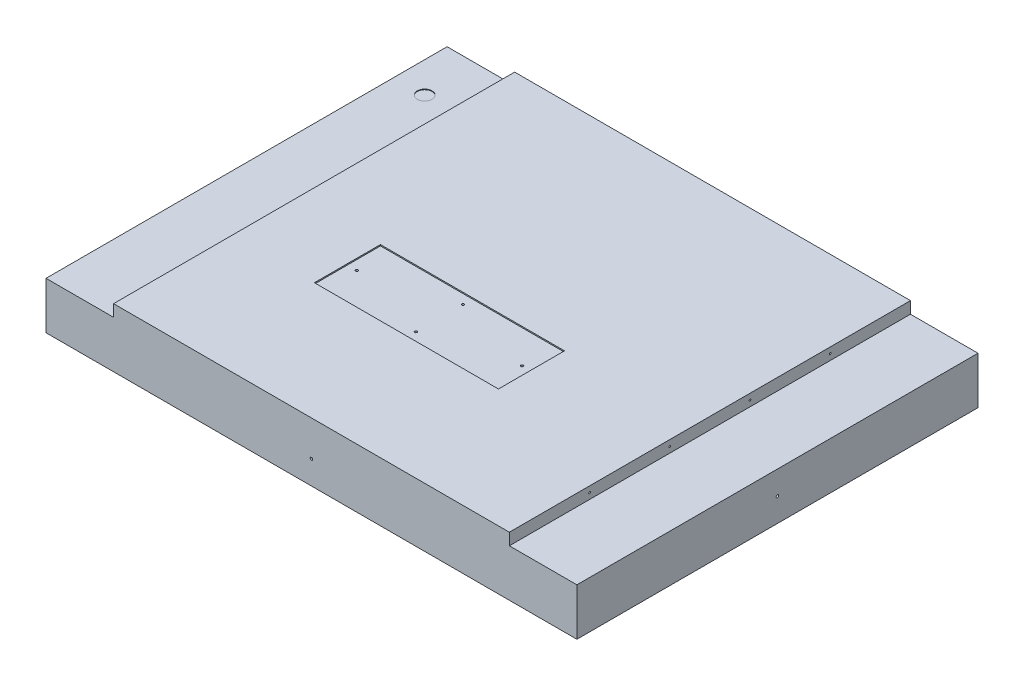
ISO-10303-21;
HEADER;
FILE_DESCRIPTION(('STEP AP214'),'2;1');
FILE_NAME('part.step','',(''),(''),'','','');
FILE_SCHEMA(('AUTOMOTIVE_DESIGN { 1 0 10303 214 1 1 1 1 }'));
ENDSEC;
DATA;
#1=APPLICATION_CONTEXT('core data for automotive mechanical design processes');
#2=APPLICATION_PROTOCOL_DEFINITION('international standard','automotive_design',2000,#1);
#3=PRODUCT_CONTEXT('',#1,'mechanical');
#4=PRODUCT('Part','Part','',(#3));
#5=PRODUCT_RELATED_PRODUCT_CATEGORY('part','',(#4));
#6=PRODUCT_DEFINITION_FORMATION('','',#4);
#7=PRODUCT_DEFINITION_CONTEXT('part definition',#1,'design');
#8=PRODUCT_DEFINITION('design','',#6,#7);
#9=PRODUCT_DEFINITION_SHAPE('','',#8);
#10=(LENGTH_UNIT() NAMED_UNIT(*) SI_UNIT(.MILLI.,.METRE.));
#11=(NAMED_UNIT(*) PLANE_ANGLE_UNIT() SI_UNIT($,.RADIAN.));
#12=(NAMED_UNIT(*) SI_UNIT($,.STERADIAN.) SOLID_ANGLE_UNIT());
#13=UNCERTAINTY_MEASURE_WITH_UNIT(LENGTH_MEASURE(1.E-05),#10,'distance_accuracy_value','');
#14=(GEOMETRIC_REPRESENTATION_CONTEXT(3) GLOBAL_UNCERTAINTY_ASSIGNED_CONTEXT((#13)) GLOBAL_UNIT_ASSIGNED_CONTEXT((#10,
#11,#12)) REPRESENTATION_CONTEXT('',''));
#15=CARTESIAN_POINT('',(0.,0.,0.));
#16=DIRECTION('',(0.,0.,1.));
#17=DIRECTION('',(1.,0.,0.));
#18=AXIS2_PLACEMENT_3D('',#15,#16,#17);
#19=CARTESIAN_POINT('',(0.,40.,340.));
#20=DIRECTION('',(0.,0.,1.));
#21=DIRECTION('',(1.,0.,0.));
#22=AXIS2_PLACEMENT_3D('',#19,#20,#21);
#23=CYLINDRICAL_SURFACE('',#22,2.09999999999995);
#24=CARTESIAN_POINT('',(0.,40.,340.));
#25=DIRECTION('',(0.,0.,1.));
#26=DIRECTION('',(1.,0.,0.));
#27=AXIS2_PLACEMENT_3D('',#24,#25,#26);
#28=CIRCLE('',#27,2.09999999999999);
#29=CARTESIAN_POINT('',(2.10000000000004,40.,340.));
#30=VERTEX_POINT('',#29);
#31=EDGE_CURVE('E240',#30,#30,#28,.T.);
#32=ORIENTED_EDGE('',*,*,#31,.T.);
#33=EDGE_LOOP('',(#32));
#34=FACE_BOUND('',#33,.T.);
#35=CARTESIAN_POINT('',(0.,40.,-1.11022302462516E-13));
#36=DIRECTION('',(0.707106781186548,0.,0.707106781186547));
#37=DIRECTION('',(-0.707106781186547,0.,0.707106781186547));
#38=AXIS2_PLACEMENT_3D('',#35,#36,#37);
#39=ELLIPSE('',#38,2.96984848098342,2.09999999999994);
#40=CARTESIAN_POINT('',(0.,37.9000000000001,-1.11022302462516E-13));
#41=VERTEX_POINT('',#40);
#42=CARTESIAN_POINT('',(0.,42.0999999999999,-1.11022302462516E-13));
#43=VERTEX_POINT('',#42);
#44=EDGE_CURVE('E55',#41,#43,#39,.F.);
#45=ORIENTED_EDGE('',*,*,#44,.T.);
#46=CARTESIAN_POINT('',(0.,40.,-1.11022302462516E-13));
#47=DIRECTION('',(-0.707106781186547,0.,0.707106781186547));
#48=DIRECTION('',(0.707106781186548,0.,0.707106781186547));
#49=AXIS2_PLACEMENT_3D('',#46,#47,#48);
#50=ELLIPSE('',#49,2.96984848098342,2.09999999999994);
#51=EDGE_CURVE('E11',#43,#41,#50,.F.);
#52=ORIENTED_EDGE('',*,*,#51,.T.);
#53=EDGE_LOOP('',(#45,#52));
#54=FACE_BOUND('',#53,.T.);
#55=ADVANCED_FACE('F42',(#34,#54),#23,.F.);
#56=CARTESIAN_POINT('',(0.,80.,0.));
#57=DIRECTION('',(0.,1.,0.));
#58=DIRECTION('',(0.,0.,1.));
#59=AXIS2_PLACEMENT_3D('',#56,#57,#58);
#60=PLANE('',#59);
#61=DIRECTION('',(0.,0.,-1.));
#62=VECTOR('',#61,1.);
#63=CARTESIAN_POINT('',(335.5,80.,-340.));
#64=LINE('',#63,#62);
#65=CARTESIAN_POINT('',(335.5,80.,340.));
#66=VERTEX_POINT('',#65);
#67=CARTESIAN_POINT('',(335.5,80.,-340.));
#68=VERTEX_POINT('',#67);
#69=EDGE_CURVE('E287',#66,#68,#64,.T.);
#70=ORIENTED_EDGE('',*,*,#69,.F.);
#71=DIRECTION('',(1.,0.,0.));
#72=VECTOR('',#71,1.);
#73=CARTESIAN_POINT('',(-450.,80.,340.));
#74=LINE('',#73,#72);
#75=CARTESIAN_POINT('',(450.,80.,340.));
#76=VERTEX_POINT('',#75);
#77=EDGE_CURVE('E329',#66,#76,#74,.T.);
#78=ORIENTED_EDGE('',*,*,#77,.T.);
#79=DIRECTION('',(0.,0.,-1.));
#80=VECTOR('',#79,1.);
#81=CARTESIAN_POINT('',(450.,80.,-340.));
#82=LINE('',#81,#80);
#83=CARTESIAN_POINT('',(450.,80.,-340.));
#84=VERTEX_POINT('',#83);
#85=EDGE_CURVE('E320',#76,#84,#82,.T.);
#86=ORIENTED_EDGE('',*,*,#85,.T.);
#87=DIRECTION('',(-1.,0.,0.));
#88=VECTOR('',#87,1.);
#89=CARTESIAN_POINT('',(-450.,80.,-340.));
#90=LINE('',#89,#88);
#91=EDGE_CURVE('E325',#84,#68,#90,.T.);
#92=ORIENTED_EDGE('',*,*,#91,.T.);
#93=EDGE_LOOP('',(#70,#78,#86,#92));
#94=FACE_BOUND('',#93,.T.);
#95=ADVANCED_FACE('F372',(#94),#60,.T.);
#96=CARTESIAN_POINT('',(450.,80.,-340.));
#97=DIRECTION('',(-1.,0.,0.));
#98=DIRECTION('',(0.,0.,1.));
#99=AXIS2_PLACEMENT_3D('',#96,#97,#98);
#100=PLANE('',#99);
#101=CARTESIAN_POINT('',(450.,40.,-1.4775762313026E-13));
#102=DIRECTION('',(-1.,0.,0.));
#103=DIRECTION('',(0.,0.,1.));
#104=AXIS2_PLACEMENT_3D('',#101,#102,#103);
#105=CIRCLE('',#104,2.09999999999989);
#106=CARTESIAN_POINT('',(450.,40.,2.09999999999974));
#107=VERTEX_POINT('',#106);
#108=EDGE_CURVE('E237',#107,#107,#105,.T.);
#109=ORIENTED_EDGE('',*,*,#108,.T.);
#110=EDGE_LOOP('',(#109));
#111=FACE_BOUND('',#110,.T.);
#112=DIRECTION('',(0.,0.,-1.));
#113=VECTOR('',#112,1.);
#114=CARTESIAN_POINT('',(450.,0.,-340.));
#115=LINE('',#114,#113);
#116=CARTESIAN_POINT('',(450.,0.,340.));
#117=VERTEX_POINT('',#116);
#118=CARTESIAN_POINT('',(450.,0.,-340.));
#119=VERTEX_POINT('',#118);
#120=EDGE_CURVE('E319',#117,#119,#115,.T.);
#121=ORIENTED_EDGE('',*,*,#120,.T.);
#122=DIRECTION('',(0.,-1.,0.));
#123=VECTOR('',#122,1.);
#124=CARTESIAN_POINT('',(450.,80.,-340.));
#125=LINE('',#124,#123);
#126=EDGE_CURVE('E348',#84,#119,#125,.T.);
#127=ORIENTED_EDGE('',*,*,#126,.F.);
#128=ORIENTED_EDGE('',*,*,#85,.F.);
#129=DIRECTION('',(0.,-1.,0.));
#130=VECTOR('',#129,1.);
#131=CARTESIAN_POINT('',(450.,80.,340.));
#132=LINE('',#131,#130);
#133=EDGE_CURVE('E332',#76,#117,#132,.T.);
#134=ORIENTED_EDGE('',*,*,#133,.T.);
#135=EDGE_LOOP('',(#121,#127,#128,#134));
#136=FACE_BOUND('',#135,.T.);
#137=ADVANCED_FACE('F44',(#111,#136),#100,.F.);
#138=CARTESIAN_POINT('',(-450.,80.,-340.));
#139=DIRECTION('',(0.,0.,1.));
#140=DIRECTION('',(1.,0.,0.));
#141=AXIS2_PLACEMENT_3D('',#138,#139,#140);
#142=PLANE('',#141);
#143=CARTESIAN_POINT('',(0.,40.,-340.));
#144=DIRECTION('',(0.,0.,1.));
#145=DIRECTION('',(1.,0.,0.));
#146=AXIS2_PLACEMENT_3D('',#143,#144,#145);
#147=CIRCLE('',#146,2.09999999999992);
#148=CARTESIAN_POINT('',(2.09999999999997,40.,-340.));
#149=VERTEX_POINT('',#148);
#150=EDGE_CURVE('E243',#149,#149,#147,.T.);
#151=ORIENTED_EDGE('',*,*,#150,.T.);
#152=EDGE_LOOP('',(#151));
#153=FACE_BOUND('',#152,.T.);
#154=DIRECTION('',(-1.,0.,0.));
#155=VECTOR('',#154,1.);
#156=CARTESIAN_POINT('',(-450.,0.,-340.));
#157=LINE('',#156,#155);
#158=CARTESIAN_POINT('',(-450.,0.,-340.));
#159=VERTEX_POINT('',#158);
#160=EDGE_CURVE('E335',#119,#159,#157,.T.);
#161=ORIENTED_EDGE('',*,*,#160,.T.);
#162=DIRECTION('',(0.,-1.,0.));
#163=VECTOR('',#162,1.);
#164=CARTESIAN_POINT('',(-450.,80.,-340.));
#165=LINE('',#164,#163);
#166=CARTESIAN_POINT('',(-450.,80.,-340.));
#167=VERTEX_POINT('',#166);
#168=EDGE_CURVE('E345',#167,#159,#165,.T.);
#169=ORIENTED_EDGE('',*,*,#168,.F.);
#170=CARTESIAN_POINT('',(-335.5,80.,-340.));
#171=VERTEX_POINT('',#170);
#172=EDGE_CURVE('E323',#171,#167,#90,.T.);
#173=ORIENTED_EDGE('',*,*,#172,.F.);
#174=DIRECTION('',(0.,-1.,0.));
#175=VECTOR('',#174,1.);
#176=CARTESIAN_POINT('',(-335.5,100.,-340.));
#177=LINE('',#176,#175);
#178=CARTESIAN_POINT('',(-335.5,100.,-340.));
#179=VERTEX_POINT('',#178);
#180=EDGE_CURVE('E313',#179,#171,#177,.T.);
#181=ORIENTED_EDGE('',*,*,#180,.F.);
#182=DIRECTION('',(-1.,0.,0.));
#183=VECTOR('',#182,1.);
#184=CARTESIAN_POINT('',(-335.5,100.,-340.));
#185=LINE('',#184,#183);
#186=CARTESIAN_POINT('',(335.5,100.,-340.));
#187=VERTEX_POINT('',#186);
#188=EDGE_CURVE('E296',#187,#179,#185,.T.);
#189=ORIENTED_EDGE('',*,*,#188,.F.);
#190=DIRECTION('',(0.,-1.,0.));
#191=VECTOR('',#190,1.);
#192=CARTESIAN_POINT('',(335.5,100.,-340.));
#193=LINE('',#192,#191);
#194=EDGE_CURVE('E316',#187,#68,#193,.T.);
#195=ORIENTED_EDGE('',*,*,#194,.T.);
#196=ORIENTED_EDGE('',*,*,#91,.F.);
#197=ORIENTED_EDGE('',*,*,#126,.T.);
#198=EDGE_LOOP('',(#161,#169,#173,#181,#189,#195,#196,#197));
#199=FACE_BOUND('',#198,.T.);
#200=ADVANCED_FACE('F466',(#153,#199),#142,.F.);
#201=CARTESIAN_POINT('',(-450.,80.,-340.));
#202=DIRECTION('',(1.,0.,0.));
#203=DIRECTION('',(0.,0.,-1.));
#204=AXIS2_PLACEMENT_3D('',#201,#202,#203);
#205=PLANE('',#204);
#206=CARTESIAN_POINT('',(-450.,40.,0.));
#207=DIRECTION('',(-1.,0.,0.));
#208=DIRECTION('',(0.,0.,1.));
#209=AXIS2_PLACEMENT_3D('',#206,#207,#208);
#210=CIRCLE('',#209,2.09999999999998);
#211=CARTESIAN_POINT('',(-450.,40.,2.09999999999991));
#212=VERTEX_POINT('',#211);
#213=EDGE_CURVE('E232',#212,#212,#210,.T.);
#214=ORIENTED_EDGE('',*,*,#213,.F.);
#215=EDGE_LOOP('',(#214));
#216=FACE_BOUND('',#215,.T.);
#217=DIRECTION('',(0.,0.,1.));
#218=VECTOR('',#217,1.);
#219=CARTESIAN_POINT('',(-450.,0.,-340.));
#220=LINE('',#219,#218);
#221=CARTESIAN_POINT('',(-450.,0.,340.));
#222=VERTEX_POINT('',#221);
#223=EDGE_CURVE('E337',#159,#222,#220,.T.);
#224=ORIENTED_EDGE('',*,*,#223,.T.);
#225=DIRECTION('',(0.,-1.,0.));
#226=VECTOR('',#225,1.);
#227=CARTESIAN_POINT('',(-450.,80.,340.));
#228=LINE('',#227,#226);
#229=CARTESIAN_POINT('',(-450.,80.,340.));
#230=VERTEX_POINT('',#229);
#231=EDGE_CURVE('E342',#230,#222,#228,.T.);
#232=ORIENTED_EDGE('',*,*,#231,.F.);
#233=DIRECTION('',(0.,0.,1.));
#234=VECTOR('',#233,1.);
#235=CARTESIAN_POINT('',(-450.,80.,-340.));
#236=LINE('',#235,#234);
#237=EDGE_CURVE('E327',#167,#230,#236,.T.);
#238=ORIENTED_EDGE('',*,*,#237,.F.);
#239=ORIENTED_EDGE('',*,*,#168,.T.);
#240=EDGE_LOOP('',(#224,#232,#238,#239));
#241=FACE_BOUND('',#240,.T.);
#242=ADVANCED_FACE('F463',(#216,#241),#205,.F.);
#243=CARTESIAN_POINT('',(-450.,80.,340.));
#244=DIRECTION('',(0.,0.,-1.));
#245=DIRECTION('',(-1.,0.,0.));
#246=AXIS2_PLACEMENT_3D('',#243,#244,#245);
#247=PLANE('',#246);
#248=ORIENTED_EDGE('',*,*,#31,.F.);
#249=EDGE_LOOP('',(#248));
#250=FACE_BOUND('',#249,.T.);
#251=DIRECTION('',(1.,0.,0.));
#252=VECTOR('',#251,1.);
#253=CARTESIAN_POINT('',(-450.,0.,340.));
#254=LINE('',#253,#252);
#255=EDGE_CURVE('E324',#222,#117,#254,.T.);
#256=ORIENTED_EDGE('',*,*,#255,.T.);
#257=ORIENTED_EDGE('',*,*,#133,.F.);
#258=ORIENTED_EDGE('',*,*,#77,.F.);
#259=DIRECTION('',(0.,-1.,0.));
#260=VECTOR('',#259,1.);
#261=CARTESIAN_POINT('',(335.5,100.,340.));
#262=LINE('',#261,#260);
#263=CARTESIAN_POINT('',(335.5,100.,340.));
#264=VERTEX_POINT('',#263);
#265=EDGE_CURVE('E303',#264,#66,#262,.T.);
#266=ORIENTED_EDGE('',*,*,#265,.F.);
#267=DIRECTION('',(1.,0.,0.));
#268=VECTOR('',#267,1.);
#269=CARTESIAN_POINT('',(-335.5,100.,340.));
#270=LINE('',#269,#268);
#271=CARTESIAN_POINT('',(-335.5,100.,340.));
#272=VERTEX_POINT('',#271);
#273=EDGE_CURVE('E301',#272,#264,#270,.T.);
#274=ORIENTED_EDGE('',*,*,#273,.F.);
#275=DIRECTION('',(0.,-1.,0.));
#276=VECTOR('',#275,1.);
#277=CARTESIAN_POINT('',(-335.5,100.,340.));
#278=LINE('',#277,#276);
#279=CARTESIAN_POINT('',(-335.5,80.,340.));
#280=VERTEX_POINT('',#279);
#281=EDGE_CURVE('E310',#272,#280,#278,.T.);
#282=ORIENTED_EDGE('',*,*,#281,.T.);
#283=EDGE_CURVE('E330',#230,#280,#74,.T.);
#284=ORIENTED_EDGE('',*,*,#283,.F.);
#285=ORIENTED_EDGE('',*,*,#231,.T.);
#286=EDGE_LOOP('',(#256,#257,#258,#266,#274,#282,#284,#285));
#287=FACE_BOUND('',#286,.T.);
#288=ADVANCED_FACE('F456',(#250,#287),#247,.F.);
#289=CARTESIAN_POINT('',(-398.,80.,-250.));
#290=DIRECTION('',(0.,1.,0.));
#291=DIRECTION('',(0.,0.,1.));
#292=AXIS2_PLACEMENT_3D('',#289,#290,#291);
#293=CIRCLE('',#292,12.5);
#294=CARTESIAN_POINT('',(-398.,80.,-237.5));
#295=VERTEX_POINT('',#294);
#296=EDGE_CURVE('E228',#295,#295,#293,.T.);
#297=ORIENTED_EDGE('',*,*,#296,.F.);
#298=EDGE_LOOP('',(#297));
#299=FACE_BOUND('',#298,.T.);
#300=DIRECTION('',(0.,0.,1.));
#301=VECTOR('',#300,1.);
#302=CARTESIAN_POINT('',(-335.5,80.,-340.));
#303=LINE('',#302,#301);
#304=EDGE_CURVE('E297',#171,#280,#303,.T.);
#305=ORIENTED_EDGE('',*,*,#304,.F.);
#306=ORIENTED_EDGE('',*,*,#172,.T.);
#307=ORIENTED_EDGE('',*,*,#237,.T.);
#308=ORIENTED_EDGE('',*,*,#283,.T.);
#309=EDGE_LOOP('',(#305,#306,#307,#308));
#310=FACE_BOUND('',#309,.T.);
#311=ADVANCED_FACE('F380',(#299,#310),#60,.T.);
#312=CARTESIAN_POINT('',(0.,0.,0.));
#313=DIRECTION('',(0.,1.,0.));
#314=DIRECTION('',(0.,0.,1.));
#315=AXIS2_PLACEMENT_3D('',#312,#313,#314);
#316=PLANE('',#315);
#317=ORIENTED_EDGE('',*,*,#120,.F.);
#318=ORIENTED_EDGE('',*,*,#255,.F.);
#319=ORIENTED_EDGE('',*,*,#223,.F.);
#320=ORIENTED_EDGE('',*,*,#160,.F.);
#321=EDGE_LOOP('',(#317,#318,#319,#320));
#322=FACE_BOUND('',#321,.T.);
#323=ADVANCED_FACE('F452',(#322),#316,.F.);
#324=CARTESIAN_POINT('',(335.5,100.,-340.));
#325=DIRECTION('',(-1.,0.,0.));
#326=DIRECTION('',(0.,0.,1.));
#327=AXIS2_PLACEMENT_3D('',#324,#325,#326);
#328=PLANE('',#327);
#329=CARTESIAN_POINT('',(335.5,90.,-204.));
#330=DIRECTION('',(1.,0.,0.));
#331=DIRECTION('',(0.,0.,-1.));
#332=AXIS2_PLACEMENT_3D('',#329,#330,#331);
#333=CIRCLE('',#332,1.44999999999999);
#334=CARTESIAN_POINT('',(335.5,90.,-205.45));
#335=VERTEX_POINT('',#334);
#336=EDGE_CURVE('E182',#335,#335,#333,.T.);
#337=ORIENTED_EDGE('',*,*,#336,.F.);
#338=EDGE_LOOP('',(#337));
#339=FACE_BOUND('',#338,.T.);
#340=CARTESIAN_POINT('',(335.5,90.,-67.9999999999999));
#341=DIRECTION('',(1.,0.,0.));
#342=DIRECTION('',(0.,0.,-1.));
#343=AXIS2_PLACEMENT_3D('',#340,#341,#342);
#344=CIRCLE('',#343,1.44999999999999);
#345=CARTESIAN_POINT('',(335.5,90.,-69.4499999999999));
#346=VERTEX_POINT('',#345);
#347=EDGE_CURVE('E181',#346,#346,#344,.T.);
#348=ORIENTED_EDGE('',*,*,#347,.F.);
#349=EDGE_LOOP('',(#348));
#350=FACE_BOUND('',#349,.T.);
#351=CARTESIAN_POINT('',(335.5,90.,68.0000000000001));
#352=DIRECTION('',(1.,0.,0.));
#353=DIRECTION('',(0.,0.,-1.));
#354=AXIS2_PLACEMENT_3D('',#351,#352,#353);
#355=CIRCLE('',#354,1.44999999999999);
#356=CARTESIAN_POINT('',(335.5,90.,66.5500000000001));
#357=VERTEX_POINT('',#356);
#358=EDGE_CURVE('E192',#357,#357,#355,.T.);
#359=ORIENTED_EDGE('',*,*,#358,.F.);
#360=EDGE_LOOP('',(#359));
#361=FACE_BOUND('',#360,.T.);
#362=CARTESIAN_POINT('',(335.5,90.,204.));
#363=DIRECTION('',(1.,0.,0.));
#364=DIRECTION('',(0.,0.,-1.));
#365=AXIS2_PLACEMENT_3D('',#362,#363,#364);
#366=CIRCLE('',#365,1.44999999999999);
#367=CARTESIAN_POINT('',(335.5,90.,202.55));
#368=VERTEX_POINT('',#367);
#369=EDGE_CURVE('E198',#368,#368,#366,.T.);
#370=ORIENTED_EDGE('',*,*,#369,.F.);
#371=EDGE_LOOP('',(#370));
#372=FACE_BOUND('',#371,.T.);
#373=ORIENTED_EDGE('',*,*,#69,.T.);
#374=ORIENTED_EDGE('',*,*,#194,.F.);
#375=DIRECTION('',(0.,0.,-1.));
#376=VECTOR('',#375,1.);
#377=CARTESIAN_POINT('',(335.5,100.,-340.));
#378=LINE('',#377,#376);
#379=EDGE_CURVE('E293',#264,#187,#378,.T.);
#380=ORIENTED_EDGE('',*,*,#379,.F.);
#381=ORIENTED_EDGE('',*,*,#265,.T.);
#382=EDGE_LOOP('',(#373,#374,#380,#381));
#383=FACE_BOUND('',#382,.T.);
#384=ADVANCED_FACE('F449',(#339,#350,#361,#372,#383),#328,.F.);
#385=CARTESIAN_POINT('',(-335.5,100.,-340.));
#386=DIRECTION('',(1.,0.,0.));
#387=DIRECTION('',(0.,0.,-1.));
#388=AXIS2_PLACEMENT_3D('',#385,#386,#387);
#389=PLANE('',#388);
#390=CARTESIAN_POINT('',(-335.5,90.,-204.));
#391=DIRECTION('',(-1.,0.,0.));
#392=DIRECTION('',(0.,0.,1.));
#393=AXIS2_PLACEMENT_3D('',#390,#391,#392);
#394=CIRCLE('',#393,1.44999999999999);
#395=CARTESIAN_POINT('',(-335.5,90.,-202.55));
#396=VERTEX_POINT('',#395);
#397=EDGE_CURVE('E204',#396,#396,#394,.T.);
#398=ORIENTED_EDGE('',*,*,#397,.F.);
#399=EDGE_LOOP('',(#398));
#400=FACE_BOUND('',#399,.T.);
#401=CARTESIAN_POINT('',(-335.5,90.,-67.9999999999999));
#402=DIRECTION('',(-1.,0.,0.));
#403=DIRECTION('',(0.,0.,1.));
#404=AXIS2_PLACEMENT_3D('',#401,#402,#403);
#405=CIRCLE('',#404,1.44999999999999);
#406=CARTESIAN_POINT('',(-335.5,90.,-66.55));
#407=VERTEX_POINT('',#406);
#408=EDGE_CURVE('E210',#407,#407,#405,.T.);
#409=ORIENTED_EDGE('',*,*,#408,.F.);
#410=EDGE_LOOP('',(#409));
#411=FACE_BOUND('',#410,.T.);
#412=CARTESIAN_POINT('',(-335.5,90.,68.0000000000001));
#413=DIRECTION('',(-1.,0.,0.));
#414=DIRECTION('',(0.,0.,1.));
#415=AXIS2_PLACEMENT_3D('',#412,#413,#414);
#416=CIRCLE('',#415,1.44999999999999);
#417=CARTESIAN_POINT('',(-335.5,90.,69.4500000000001));
#418=VERTEX_POINT('',#417);
#419=EDGE_CURVE('E216',#418,#418,#416,.T.);
#420=ORIENTED_EDGE('',*,*,#419,.F.);
#421=EDGE_LOOP('',(#420));
#422=FACE_BOUND('',#421,.T.);
#423=CARTESIAN_POINT('',(-335.5,90.,204.));
#424=DIRECTION('',(-1.,0.,0.));
#425=DIRECTION('',(0.,0.,1.));
#426=AXIS2_PLACEMENT_3D('',#423,#424,#425);
#427=CIRCLE('',#426,1.44999999999999);
#428=CARTESIAN_POINT('',(-335.5,90.,205.45));
#429=VERTEX_POINT('',#428);
#430=EDGE_CURVE('E222',#429,#429,#427,.T.);
#431=ORIENTED_EDGE('',*,*,#430,.F.);
#432=EDGE_LOOP('',(#431));
#433=FACE_BOUND('',#432,.T.);
#434=ORIENTED_EDGE('',*,*,#304,.T.);
#435=ORIENTED_EDGE('',*,*,#281,.F.);
#436=DIRECTION('',(0.,0.,1.));
#437=VECTOR('',#436,1.);
#438=CARTESIAN_POINT('',(-335.5,100.,-340.));
#439=LINE('',#438,#437);
#440=EDGE_CURVE('E299',#179,#272,#439,.T.);
#441=ORIENTED_EDGE('',*,*,#440,.F.);
#442=ORIENTED_EDGE('',*,*,#180,.T.);
#443=EDGE_LOOP('',(#434,#435,#441,#442));
#444=FACE_BOUND('',#443,.T.);
#445=ADVANCED_FACE('F445',(#400,#411,#422,#433,#444),#389,.F.);
#446=CARTESIAN_POINT('',(0.,100.,0.));
#447=DIRECTION('',(0.,1.,0.));
#448=DIRECTION('',(0.,0.,1.));
#449=AXIS2_PLACEMENT_3D('',#446,#447,#448);
#450=PLANE('',#449);
#451=DIRECTION('',(0.,0.,-1.));
#452=VECTOR('',#451,1.);
#453=CARTESIAN_POINT('',(116.,100.,27.));
#454=LINE('',#453,#452);
#455=CARTESIAN_POINT('',(116.,100.,139.));
#456=VERTEX_POINT('',#455);
#457=CARTESIAN_POINT('',(116.,100.,27.));
#458=VERTEX_POINT('',#457);
#459=EDGE_CURVE('E63',#456,#458,#454,.T.);
#460=ORIENTED_EDGE('',*,*,#459,.F.);
#461=DIRECTION('',(1.,0.,0.));
#462=VECTOR('',#461,1.);
#463=CARTESIAN_POINT('',(-196.,100.,139.));
#464=LINE('',#463,#462);
#465=CARTESIAN_POINT('',(-196.,100.,139.));
#466=VERTEX_POINT('',#465);
#467=EDGE_CURVE('E266',#466,#456,#464,.T.);
#468=ORIENTED_EDGE('',*,*,#467,.F.);
#469=DIRECTION('',(0.,0.,1.));
#470=VECTOR('',#469,1.);
#471=CARTESIAN_POINT('',(-196.,100.,27.));
#472=LINE('',#471,#470);
#473=CARTESIAN_POINT('',(-196.,100.,27.));
#474=VERTEX_POINT('',#473);
#475=EDGE_CURVE('E280',#474,#466,#472,.T.);
#476=ORIENTED_EDGE('',*,*,#475,.F.);
#477=DIRECTION('',(-1.,0.,0.));
#478=VECTOR('',#477,1.);
#479=CARTESIAN_POINT('',(-196.,100.,27.));
#480=LINE('',#479,#478);
#481=EDGE_CURVE('E277',#458,#474,#480,.T.);
#482=ORIENTED_EDGE('',*,*,#481,.F.);
#483=EDGE_LOOP('',(#460,#468,#476,#482));
#484=FACE_BOUND('',#483,.T.);
#485=ORIENTED_EDGE('',*,*,#379,.T.);
#486=ORIENTED_EDGE('',*,*,#188,.T.);
#487=ORIENTED_EDGE('',*,*,#440,.T.);
#488=ORIENTED_EDGE('',*,*,#273,.T.);
#489=EDGE_LOOP('',(#485,#486,#487,#488));
#490=FACE_BOUND('',#489,.T.);
#491=ADVANCED_FACE('F442',(#484,#490),#450,.T.);
#492=CARTESIAN_POINT('',(116.,98.,27.));
#493=DIRECTION('',(1.,0.,0.));
#494=DIRECTION('',(0.,0.,-1.));
#495=AXIS2_PLACEMENT_3D('',#492,#493,#494);
#496=PLANE('',#495);
#497=ORIENTED_EDGE('',*,*,#459,.T.);
#498=DIRECTION('',(0.,1.,0.));
#499=VECTOR('',#498,1.);
#500=CARTESIAN_POINT('',(116.,98.,27.));
#501=LINE('',#500,#499);
#502=CARTESIAN_POINT('',(116.,98.,27.));
#503=VERTEX_POINT('',#502);
#504=EDGE_CURVE('E275',#503,#458,#501,.T.);
#505=ORIENTED_EDGE('',*,*,#504,.F.);
#506=DIRECTION('',(0.,0.,-1.));
#507=VECTOR('',#506,1.);
#508=CARTESIAN_POINT('',(116.,98.,27.));
#509=LINE('',#508,#507);
#510=CARTESIAN_POINT('',(116.,98.,139.));
#511=VERTEX_POINT('',#510);
#512=EDGE_CURVE('E262',#511,#503,#509,.T.);
#513=ORIENTED_EDGE('',*,*,#512,.F.);
#514=DIRECTION('',(0.,1.,0.));
#515=VECTOR('',#514,1.);
#516=CARTESIAN_POINT('',(116.,98.,139.));
#517=LINE('',#516,#515);
#518=EDGE_CURVE('E285',#511,#456,#517,.T.);
#519=ORIENTED_EDGE('',*,*,#518,.T.);
#520=EDGE_LOOP('',(#497,#505,#513,#519));
#521=FACE_BOUND('',#520,.T.);
#522=ADVANCED_FACE('F432',(#521),#496,.F.);
#523=CARTESIAN_POINT('',(-196.,98.,139.));
#524=DIRECTION('',(0.,0.,1.));
#525=DIRECTION('',(1.,0.,0.));
#526=AXIS2_PLACEMENT_3D('',#523,#524,#525);
#527=PLANE('',#526);
#528=ORIENTED_EDGE('',*,*,#467,.T.);
#529=ORIENTED_EDGE('',*,*,#518,.F.);
#530=DIRECTION('',(1.,0.,0.));
#531=VECTOR('',#530,1.);
#532=CARTESIAN_POINT('',(-196.,98.,139.));
#533=LINE('',#532,#531);
#534=CARTESIAN_POINT('',(-196.,98.,139.));
#535=VERTEX_POINT('',#534);
#536=EDGE_CURVE('E272',#535,#511,#533,.T.);
#537=ORIENTED_EDGE('',*,*,#536,.F.);
#538=DIRECTION('',(0.,1.,0.));
#539=VECTOR('',#538,1.);
#540=CARTESIAN_POINT('',(-196.,98.,139.));
#541=LINE('',#540,#539);
#542=EDGE_CURVE('E288',#535,#466,#541,.T.);
#543=ORIENTED_EDGE('',*,*,#542,.T.);
#544=EDGE_LOOP('',(#528,#529,#537,#543));
#545=FACE_BOUND('',#544,.T.);
#546=ADVANCED_FACE('F428',(#545),#527,.F.);
#547=CARTESIAN_POINT('',(-196.,98.,27.));
#548=DIRECTION('',(-1.,0.,0.));
#549=DIRECTION('',(0.,0.,1.));
#550=AXIS2_PLACEMENT_3D('',#547,#548,#549);
#551=PLANE('',#550);
#552=ORIENTED_EDGE('',*,*,#475,.T.);
#553=ORIENTED_EDGE('',*,*,#542,.F.);
#554=DIRECTION('',(0.,0.,1.));
#555=VECTOR('',#554,1.);
#556=CARTESIAN_POINT('',(-196.,98.,27.));
#557=LINE('',#556,#555);
#558=CARTESIAN_POINT('',(-196.,98.,27.));
#559=VERTEX_POINT('',#558);
#560=EDGE_CURVE('E269',#559,#535,#557,.T.);
#561=ORIENTED_EDGE('',*,*,#560,.F.);
#562=DIRECTION('',(0.,1.,0.));
#563=VECTOR('',#562,1.);
#564=CARTESIAN_POINT('',(-196.,98.,27.));
#565=LINE('',#564,#563);
#566=EDGE_CURVE('E290',#559,#474,#565,.T.);
#567=ORIENTED_EDGE('',*,*,#566,.T.);
#568=EDGE_LOOP('',(#552,#553,#561,#567));
#569=FACE_BOUND('',#568,.T.);
#570=ADVANCED_FACE('F431',(#569),#551,.F.);
#571=CARTESIAN_POINT('',(-196.,98.,27.));
#572=DIRECTION('',(0.,0.,-1.));
#573=DIRECTION('',(-1.,0.,0.));
#574=AXIS2_PLACEMENT_3D('',#571,#572,#573);
#575=PLANE('',#574);
#576=ORIENTED_EDGE('',*,*,#481,.T.);
#577=ORIENTED_EDGE('',*,*,#566,.F.);
#578=DIRECTION('',(-1.,0.,0.));
#579=VECTOR('',#578,1.);
#580=CARTESIAN_POINT('',(-196.,98.,27.));
#581=LINE('',#580,#579);
#582=EDGE_CURVE('E265',#503,#559,#581,.T.);
#583=ORIENTED_EDGE('',*,*,#582,.F.);
#584=ORIENTED_EDGE('',*,*,#504,.T.);
#585=EDGE_LOOP('',(#576,#577,#583,#584));
#586=FACE_BOUND('',#585,.T.);
#587=ADVANCED_FACE('F426',(#586),#575,.F.);
#588=CARTESIAN_POINT('',(0.,98.,0.));
#589=DIRECTION('',(0.,1.,0.));
#590=DIRECTION('',(0.,0.,1.));
#591=AXIS2_PLACEMENT_3D('',#588,#589,#590);
#592=PLANE('',#591);
#593=CARTESIAN_POINT('',(-180.,98.,83.));
#594=DIRECTION('',(0.,1.,0.));
#595=DIRECTION('',(0.,0.,1.));
#596=AXIS2_PLACEMENT_3D('',#593,#594,#595);
#597=CIRCLE('',#596,2.09999999999999);
#598=CARTESIAN_POINT('',(-180.,98.,85.1));
#599=VERTEX_POINT('',#598);
#600=EDGE_CURVE('E249',#599,#599,#597,.T.);
#601=ORIENTED_EDGE('',*,*,#600,.F.);
#602=EDGE_LOOP('',(#601));
#603=FACE_BOUND('',#602,.T.);
#604=CARTESIAN_POINT('',(-40.,98.,43.));
#605=DIRECTION('',(0.,1.,0.));
#606=DIRECTION('',(0.,0.,1.));
#607=AXIS2_PLACEMENT_3D('',#604,#605,#606);
#608=CIRCLE('',#607,2.09999999999999);
#609=CARTESIAN_POINT('',(-40.,98.,45.1));
#610=VERTEX_POINT('',#609);
#611=EDGE_CURVE('E253',#610,#610,#608,.T.);
#612=ORIENTED_EDGE('',*,*,#611,.F.);
#613=EDGE_LOOP('',(#612));
#614=FACE_BOUND('',#613,.T.);
#615=CARTESIAN_POINT('',(-40.,98.,123.));
#616=DIRECTION('',(0.,1.,0.));
#617=DIRECTION('',(0.,0.,1.));
#618=AXIS2_PLACEMENT_3D('',#615,#616,#617);
#619=CIRCLE('',#618,2.09999999999999);
#620=CARTESIAN_POINT('',(-40.,98.,125.1));
#621=VERTEX_POINT('',#620);
#622=EDGE_CURVE('E257',#621,#621,#619,.T.);
#623=ORIENTED_EDGE('',*,*,#622,.F.);
#624=EDGE_LOOP('',(#623));
#625=FACE_BOUND('',#624,.T.);
#626=CARTESIAN_POINT('',(100.,98.,83.));
#627=DIRECTION('',(0.,1.,0.));
#628=DIRECTION('',(0.,0.,1.));
#629=AXIS2_PLACEMENT_3D('',#626,#627,#628);
#630=CIRCLE('',#629,2.1);
#631=CARTESIAN_POINT('',(100.,98.,85.1));
#632=VERTEX_POINT('',#631);
#633=EDGE_CURVE('E261',#632,#632,#630,.T.);
#634=ORIENTED_EDGE('',*,*,#633,.F.);
#635=EDGE_LOOP('',(#634));
#636=FACE_BOUND('',#635,.T.);
#637=ORIENTED_EDGE('',*,*,#512,.T.);
#638=ORIENTED_EDGE('',*,*,#582,.T.);
#639=ORIENTED_EDGE('',*,*,#560,.T.);
#640=ORIENTED_EDGE('',*,*,#536,.T.);
#641=EDGE_LOOP('',(#637,#638,#639,#640));
#642=FACE_BOUND('',#641,.T.);
#643=ADVANCED_FACE('F422',(#603,#614,#625,#636,#642),#592,.T.);
#644=CARTESIAN_POINT('',(100.,91.,83.));
#645=DIRECTION('',(0.,1.,0.));
#646=DIRECTION('',(0.,0.,1.));
#647=AXIS2_PLACEMENT_3D('',#644,#645,#646);
#648=CONICAL_SURFACE('',#647,2.1,1.02974425867666);
#649=CARTESIAN_POINT('',(100.,89.7381927000421,83.));
#650=VERTEX_POINT('',#649);
#651=VERTEX_LOOP('',#650);
#652=FACE_BOUND('',#651,.T.);
#653=CARTESIAN_POINT('',(100.,91.,83.));
#654=DIRECTION('',(0.,1.,0.));
#655=DIRECTION('',(0.,0.,1.));
#656=AXIS2_PLACEMENT_3D('',#653,#654,#655);
#657=CIRCLE('',#656,2.1);
#658=CARTESIAN_POINT('',(100.,91.,85.1));
#659=VERTEX_POINT('',#658);
#660=EDGE_CURVE('E258',#659,#659,#657,.T.);
#661=ORIENTED_EDGE('',*,*,#660,.T.);
#662=EDGE_LOOP('',(#661));
#663=FACE_BOUND('',#662,.T.);
#664=ADVANCED_FACE('F418',(#652,#663),#648,.F.);
#665=CARTESIAN_POINT('',(100.,100.,83.));
#666=DIRECTION('',(0.,1.,0.));
#667=DIRECTION('',(0.,0.,1.));
#668=AXIS2_PLACEMENT_3D('',#665,#666,#667);
#669=CYLINDRICAL_SURFACE('',#668,2.1);
#670=ORIENTED_EDGE('',*,*,#633,.T.);
#671=EDGE_LOOP('',(#670));
#672=FACE_BOUND('',#671,.T.);
#673=ORIENTED_EDGE('',*,*,#660,.F.);
#674=EDGE_LOOP('',(#673));
#675=FACE_BOUND('',#674,.T.);
#676=ADVANCED_FACE('F414',(#672,#675),#669,.F.);
#677=CARTESIAN_POINT('',(-40.,91.,123.));
#678=DIRECTION('',(0.,1.,0.));
#679=DIRECTION('',(0.,0.,1.));
#680=AXIS2_PLACEMENT_3D('',#677,#678,#679);
#681=CONICAL_SURFACE('',#680,2.1,1.02974425867666);
#682=CARTESIAN_POINT('',(-40.,89.7381927000421,123.));
#683=VERTEX_POINT('',#682);
#684=VERTEX_LOOP('',#683);
#685=FACE_BOUND('',#684,.T.);
#686=CARTESIAN_POINT('',(-40.,91.,123.));
#687=DIRECTION('',(0.,1.,0.));
#688=DIRECTION('',(0.,0.,1.));
#689=AXIS2_PLACEMENT_3D('',#686,#687,#688);
#690=CIRCLE('',#689,2.1);
#691=CARTESIAN_POINT('',(-40.,91.,125.1));
#692=VERTEX_POINT('',#691);
#693=EDGE_CURVE('E254',#692,#692,#690,.T.);
#694=ORIENTED_EDGE('',*,*,#693,.T.);
#695=EDGE_LOOP('',(#694));
#696=FACE_BOUND('',#695,.T.);
#697=ADVANCED_FACE('F410',(#685,#696),#681,.F.);
#698=CARTESIAN_POINT('',(-40.,100.,123.));
#699=DIRECTION('',(0.,1.,0.));
#700=DIRECTION('',(0.,0.,1.));
#701=AXIS2_PLACEMENT_3D('',#698,#699,#700);
#702=CYLINDRICAL_SURFACE('',#701,2.09999999999999);
#703=ORIENTED_EDGE('',*,*,#622,.T.);
#704=EDGE_LOOP('',(#703));
#705=FACE_BOUND('',#704,.T.);
#706=ORIENTED_EDGE('',*,*,#693,.F.);
#707=EDGE_LOOP('',(#706));
#708=FACE_BOUND('',#707,.T.);
#709=ADVANCED_FACE('F406',(#705,#708),#702,.F.);
#710=CARTESIAN_POINT('',(-40.,91.,43.));
#711=DIRECTION('',(0.,1.,0.));
#712=DIRECTION('',(0.,0.,1.));
#713=AXIS2_PLACEMENT_3D('',#710,#711,#712);
#714=CONICAL_SURFACE('',#713,2.1,1.02974425867666);
#715=CARTESIAN_POINT('',(-40.,89.7381927000421,43.));
#716=VERTEX_POINT('',#715);
#717=VERTEX_LOOP('',#716);
#718=FACE_BOUND('',#717,.T.);
#719=CARTESIAN_POINT('',(-40.,91.,43.));
#720=DIRECTION('',(0.,1.,0.));
#721=DIRECTION('',(0.,0.,1.));
#722=AXIS2_PLACEMENT_3D('',#719,#720,#721);
#723=CIRCLE('',#722,2.1);
#724=CARTESIAN_POINT('',(-40.,91.,45.1));
#725=VERTEX_POINT('',#724);
#726=EDGE_CURVE('E250',#725,#725,#723,.T.);
#727=ORIENTED_EDGE('',*,*,#726,.T.);
#728=EDGE_LOOP('',(#727));
#729=FACE_BOUND('',#728,.T.);
#730=ADVANCED_FACE('F402',(#718,#729),#714,.F.);
#731=CARTESIAN_POINT('',(-40.,100.,43.));
#732=DIRECTION('',(0.,1.,0.));
#733=DIRECTION('',(0.,0.,1.));
#734=AXIS2_PLACEMENT_3D('',#731,#732,#733);
#735=CYLINDRICAL_SURFACE('',#734,2.09999999999999);
#736=ORIENTED_EDGE('',*,*,#611,.T.);
#737=EDGE_LOOP('',(#736));
#738=FACE_BOUND('',#737,.T.);
#739=ORIENTED_EDGE('',*,*,#726,.F.);
#740=EDGE_LOOP('',(#739));
#741=FACE_BOUND('',#740,.T.);
#742=ADVANCED_FACE('F395',(#738,#741),#735,.F.);
#743=CARTESIAN_POINT('',(-180.,91.,83.));
#744=DIRECTION('',(0.,1.,0.));
#745=DIRECTION('',(0.,0.,1.));
#746=AXIS2_PLACEMENT_3D('',#743,#744,#745);
#747=CONICAL_SURFACE('',#746,2.09999999999999,1.02974425867666);
#748=CARTESIAN_POINT('',(-180.,89.7381927000421,83.));
#749=VERTEX_POINT('',#748);
#750=VERTEX_LOOP('',#749);
#751=FACE_BOUND('',#750,.T.);
#752=CARTESIAN_POINT('',(-180.,91.,83.));
#753=DIRECTION('',(0.,1.,0.));
#754=DIRECTION('',(0.,0.,1.));
#755=AXIS2_PLACEMENT_3D('',#752,#753,#754);
#756=CIRCLE('',#755,2.09999999999999);
#757=CARTESIAN_POINT('',(-180.,91.,85.1));
#758=VERTEX_POINT('',#757);
#759=EDGE_CURVE('E246',#758,#758,#756,.T.);
#760=ORIENTED_EDGE('',*,*,#759,.T.);
#761=EDGE_LOOP('',(#760));
#762=FACE_BOUND('',#761,.T.);
#763=ADVANCED_FACE('F390',(#751,#762),#747,.F.);
#764=CARTESIAN_POINT('',(-180.,100.,83.));
#765=DIRECTION('',(0.,1.,0.));
#766=DIRECTION('',(0.,0.,1.));
#767=AXIS2_PLACEMENT_3D('',#764,#765,#766);
#768=CYLINDRICAL_SURFACE('',#767,2.09999999999999);
#769=ORIENTED_EDGE('',*,*,#600,.T.);
#770=EDGE_LOOP('',(#769));
#771=FACE_BOUND('',#770,.T.);
#772=ORIENTED_EDGE('',*,*,#759,.F.);
#773=EDGE_LOOP('',(#772));
#774=FACE_BOUND('',#773,.T.);
#775=ADVANCED_FACE('F384',(#771,#774),#768,.F.);
#776=CARTESIAN_POINT('',(0.,40.,-1.11022302462516E-13));
#777=DIRECTION('',(0.707106781186548,0.,0.707106781186547));
#778=DIRECTION('',(-0.707106781186547,0.,0.707106781186547));
#779=AXIS2_PLACEMENT_3D('',#776,#777,#778);
#780=ELLIPSE('',#779,2.96984848098342,2.09999999999994);
#781=EDGE_CURVE('E360',#41,#43,#780,.T.);
#782=ORIENTED_EDGE('',*,*,#781,.T.);
#783=CARTESIAN_POINT('',(0.,40.,-1.11022302462516E-13));
#784=DIRECTION('',(-0.707106781186547,0.,0.707106781186547));
#785=DIRECTION('',(0.707106781186548,0.,0.707106781186547));
#786=AXIS2_PLACEMENT_3D('',#783,#784,#785);
#787=ELLIPSE('',#786,2.96984848098342,2.09999999999994);
#788=EDGE_CURVE('E50',#43,#41,#787,.T.);
#789=ORIENTED_EDGE('',*,*,#788,.T.);
#790=EDGE_LOOP('',(#782,#789));
#791=FACE_BOUND('',#790,.T.);
#792=ORIENTED_EDGE('',*,*,#150,.F.);
#793=EDGE_LOOP('',(#792));
#794=FACE_BOUND('',#793,.T.);
#795=ADVANCED_FACE('F364',(#791,#794),#23,.F.);
#796=CARTESIAN_POINT('',(-450.,40.,0.));
#797=DIRECTION('',(-1.,0.,0.));
#798=DIRECTION('',(0.,0.,1.));
#799=AXIS2_PLACEMENT_3D('',#796,#797,#798);
#800=CYLINDRICAL_SURFACE('',#799,2.09999999999994);
#801=ORIENTED_EDGE('',*,*,#213,.T.);
#802=EDGE_LOOP('',(#801));
#803=FACE_BOUND('',#802,.T.);
#804=ORIENTED_EDGE('',*,*,#44,.F.);
#805=ORIENTED_EDGE('',*,*,#788,.F.);
#806=EDGE_LOOP('',(#804,#805));
#807=FACE_BOUND('',#806,.T.);
#808=ADVANCED_FACE('F368',(#803,#807),#800,.F.);
#809=ORIENTED_EDGE('',*,*,#108,.F.);
#810=EDGE_LOOP('',(#809));
#811=FACE_BOUND('',#810,.T.);
#812=ORIENTED_EDGE('',*,*,#781,.F.);
#813=ORIENTED_EDGE('',*,*,#51,.F.);
#814=EDGE_LOOP('',(#812,#813));
#815=FACE_BOUND('',#814,.T.);
#816=ADVANCED_FACE('F370',(#811,#815),#800,.F.);
#817=CARTESIAN_POINT('',(-398.,79.,-250.));
#818=DIRECTION('',(0.,1.,0.));
#819=DIRECTION('',(0.,0.,1.));
#820=AXIS2_PLACEMENT_3D('',#817,#818,#819);
#821=CYLINDRICAL_SURFACE('',#820,12.5);
#822=CARTESIAN_POINT('',(-398.,79.,-250.));
#823=DIRECTION('',(0.,1.,0.));
#824=DIRECTION('',(0.,0.,1.));
#825=AXIS2_PLACEMENT_3D('',#822,#823,#824);
#826=CIRCLE('',#825,12.5);
#827=CARTESIAN_POINT('',(-398.,79.,-237.5));
#828=VERTEX_POINT('',#827);
#829=EDGE_CURVE('E229',#828,#828,#826,.T.);
#830=ORIENTED_EDGE('',*,*,#829,.F.);
#831=EDGE_LOOP('',(#830));
#832=FACE_BOUND('',#831,.T.);
#833=ORIENTED_EDGE('',*,*,#296,.T.);
#834=EDGE_LOOP('',(#833));
#835=FACE_BOUND('',#834,.T.);
#836=ADVANCED_FACE('F507',(#832,#835),#821,.F.);
#837=CARTESIAN_POINT('',(-398.,79.,-250.));
#838=DIRECTION('',(0.,1.,0.));
#839=DIRECTION('',(0.,0.,1.));
#840=AXIS2_PLACEMENT_3D('',#837,#838,#839);
#841=PLANE('',#840);
#842=ORIENTED_EDGE('',*,*,#829,.T.);
#843=EDGE_LOOP('',(#842));
#844=FACE_BOUND('',#843,.T.);
#845=ADVANCED_FACE('F511',(#844),#841,.T.);
#846=CARTESIAN_POINT('',(-328.1,90.,204.));
#847=DIRECTION('',(-1.,0.,0.));
#848=DIRECTION('',(0.,0.,1.));
#849=AXIS2_PLACEMENT_3D('',#846,#847,#848);
#850=CONICAL_SURFACE('',#849,1.44999999999999,1.02974425867665);
#851=CARTESIAN_POINT('',(-327.22875210241,90.,204.));
#852=VERTEX_POINT('',#851);
#853=VERTEX_LOOP('',#852);
#854=FACE_BOUND('',#853,.T.);
#855=CARTESIAN_POINT('',(-328.1,90.,204.));
#856=DIRECTION('',(-1.,0.,0.));
#857=DIRECTION('',(0.,0.,1.));
#858=AXIS2_PLACEMENT_3D('',#855,#856,#857);
#859=CIRCLE('',#858,1.44999999999999);
#860=CARTESIAN_POINT('',(-328.1,90.,205.45));
#861=VERTEX_POINT('',#860);
#862=EDGE_CURVE('E225',#861,#861,#859,.T.);
#863=ORIENTED_EDGE('',*,*,#862,.T.);
#864=EDGE_LOOP('',(#863));
#865=FACE_BOUND('',#864,.T.);
#866=ADVANCED_FACE('F517',(#854,#865),#850,.F.);
#867=CARTESIAN_POINT('',(-335.5,90.,204.));
#868=DIRECTION('',(-1.,0.,0.));
#869=DIRECTION('',(0.,0.,1.));
#870=AXIS2_PLACEMENT_3D('',#867,#868,#869);
#871=CYLINDRICAL_SURFACE('',#870,1.44999999999999);
#872=ORIENTED_EDGE('',*,*,#862,.F.);
#873=EDGE_LOOP('',(#872));
#874=FACE_BOUND('',#873,.T.);
#875=ORIENTED_EDGE('',*,*,#430,.T.);
#876=EDGE_LOOP('',(#875));
#877=FACE_BOUND('',#876,.T.);
#878=ADVANCED_FACE('F521',(#874,#877),#871,.F.);
#879=CARTESIAN_POINT('',(-328.1,90.,68.0000000000001));
#880=DIRECTION('',(-1.,0.,0.));
#881=DIRECTION('',(0.,0.,1.));
#882=AXIS2_PLACEMENT_3D('',#879,#880,#881);
#883=CONICAL_SURFACE('',#882,1.44999999999999,1.02974425867665);
#884=CARTESIAN_POINT('',(-327.22875210241,90.,68.0000000000001));
#885=VERTEX_POINT('',#884);
#886=VERTEX_LOOP('',#885);
#887=FACE_BOUND('',#886,.T.);
#888=CARTESIAN_POINT('',(-328.1,90.,68.0000000000001));
#889=DIRECTION('',(-1.,0.,0.));
#890=DIRECTION('',(0.,0.,1.));
#891=AXIS2_PLACEMENT_3D('',#888,#889,#890);
#892=CIRCLE('',#891,1.44999999999999);
#893=CARTESIAN_POINT('',(-328.1,90.,69.4500000000001));
#894=VERTEX_POINT('',#893);
#895=EDGE_CURVE('E219',#894,#894,#892,.T.);
#896=ORIENTED_EDGE('',*,*,#895,.T.);
#897=EDGE_LOOP('',(#896));
#898=FACE_BOUND('',#897,.T.);
#899=ADVANCED_FACE('F525',(#887,#898),#883,.F.);
#900=CARTESIAN_POINT('',(-335.5,90.,68.0000000000001));
#901=DIRECTION('',(-1.,0.,0.));
#902=DIRECTION('',(0.,0.,1.));
#903=AXIS2_PLACEMENT_3D('',#900,#901,#902);
#904=CYLINDRICAL_SURFACE('',#903,1.44999999999999);
#905=ORIENTED_EDGE('',*,*,#895,.F.);
#906=EDGE_LOOP('',(#905));
#907=FACE_BOUND('',#906,.T.);
#908=ORIENTED_EDGE('',*,*,#419,.T.);
#909=EDGE_LOOP('',(#908));
#910=FACE_BOUND('',#909,.T.);
#911=ADVANCED_FACE('F529',(#907,#910),#904,.F.);
#912=CARTESIAN_POINT('',(-328.1,90.,-67.9999999999999));
#913=DIRECTION('',(-1.,0.,0.));
#914=DIRECTION('',(0.,0.,1.));
#915=AXIS2_PLACEMENT_3D('',#912,#913,#914);
#916=CONICAL_SURFACE('',#915,1.44999999999999,1.02974425867665);
#917=CARTESIAN_POINT('',(-327.22875210241,90.,-67.9999999999999));
#918=VERTEX_POINT('',#917);
#919=VERTEX_LOOP('',#918);
#920=FACE_BOUND('',#919,.T.);
#921=CARTESIAN_POINT('',(-328.1,90.,-67.9999999999999));
#922=DIRECTION('',(-1.,0.,0.));
#923=DIRECTION('',(0.,0.,1.));
#924=AXIS2_PLACEMENT_3D('',#921,#922,#923);
#925=CIRCLE('',#924,1.44999999999999);
#926=CARTESIAN_POINT('',(-328.1,90.,-66.55));
#927=VERTEX_POINT('',#926);
#928=EDGE_CURVE('E213',#927,#927,#925,.T.);
#929=ORIENTED_EDGE('',*,*,#928,.T.);
#930=EDGE_LOOP('',(#929));
#931=FACE_BOUND('',#930,.T.);
#932=ADVANCED_FACE('F533',(#920,#931),#916,.F.);
#933=CARTESIAN_POINT('',(-335.5,90.,-67.9999999999999));
#934=DIRECTION('',(-1.,0.,0.));
#935=DIRECTION('',(0.,0.,1.));
#936=AXIS2_PLACEMENT_3D('',#933,#934,#935);
#937=CYLINDRICAL_SURFACE('',#936,1.44999999999999);
#938=ORIENTED_EDGE('',*,*,#928,.F.);
#939=EDGE_LOOP('',(#938));
#940=FACE_BOUND('',#939,.T.);
#941=ORIENTED_EDGE('',*,*,#408,.T.);
#942=EDGE_LOOP('',(#941));
#943=FACE_BOUND('',#942,.T.);
#944=ADVANCED_FACE('F537',(#940,#943),#937,.F.);
#945=CARTESIAN_POINT('',(-328.1,90.,-204.));
#946=DIRECTION('',(-1.,0.,0.));
#947=DIRECTION('',(0.,0.,1.));
#948=AXIS2_PLACEMENT_3D('',#945,#946,#947);
#949=CONICAL_SURFACE('',#948,1.44999999999999,1.02974425867665);
#950=CARTESIAN_POINT('',(-327.22875210241,90.,-204.));
#951=VERTEX_POINT('',#950);
#952=VERTEX_LOOP('',#951);
#953=FACE_BOUND('',#952,.T.);
#954=CARTESIAN_POINT('',(-328.1,90.,-204.));
#955=DIRECTION('',(-1.,0.,0.));
#956=DIRECTION('',(0.,0.,1.));
#957=AXIS2_PLACEMENT_3D('',#954,#955,#956);
#958=CIRCLE('',#957,1.44999999999999);
#959=CARTESIAN_POINT('',(-328.1,90.,-202.55));
#960=VERTEX_POINT('',#959);
#961=EDGE_CURVE('E207',#960,#960,#958,.T.);
#962=ORIENTED_EDGE('',*,*,#961,.T.);
#963=EDGE_LOOP('',(#962));
#964=FACE_BOUND('',#963,.T.);
#965=ADVANCED_FACE('F541',(#953,#964),#949,.F.);
#966=CARTESIAN_POINT('',(-335.5,90.,-204.));
#967=DIRECTION('',(-1.,0.,0.));
#968=DIRECTION('',(0.,0.,1.));
#969=AXIS2_PLACEMENT_3D('',#966,#967,#968);
#970=CYLINDRICAL_SURFACE('',#969,1.44999999999999);
#971=ORIENTED_EDGE('',*,*,#961,.F.);
#972=EDGE_LOOP('',(#971));
#973=FACE_BOUND('',#972,.T.);
#974=ORIENTED_EDGE('',*,*,#397,.T.);
#975=EDGE_LOOP('',(#974));
#976=FACE_BOUND('',#975,.T.);
#977=ADVANCED_FACE('F545',(#973,#976),#970,.F.);
#978=CARTESIAN_POINT('',(328.1,90.,204.));
#979=DIRECTION('',(1.,0.,0.));
#980=DIRECTION('',(0.,0.,-1.));
#981=AXIS2_PLACEMENT_3D('',#978,#979,#980);
#982=CONICAL_SURFACE('',#981,1.44999999999999,1.02974425867665);
#983=CARTESIAN_POINT('',(327.22875210241,90.,204.));
#984=VERTEX_POINT('',#983);
#985=VERTEX_LOOP('',#984);
#986=FACE_BOUND('',#985,.T.);
#987=CARTESIAN_POINT('',(328.1,90.,204.));
#988=DIRECTION('',(1.,0.,0.));
#989=DIRECTION('',(0.,0.,-1.));
#990=AXIS2_PLACEMENT_3D('',#987,#988,#989);
#991=CIRCLE('',#990,1.44999999999999);
#992=CARTESIAN_POINT('',(328.1,90.,202.55));
#993=VERTEX_POINT('',#992);
#994=EDGE_CURVE('E201',#993,#993,#991,.T.);
#995=ORIENTED_EDGE('',*,*,#994,.T.);
#996=EDGE_LOOP('',(#995));
#997=FACE_BOUND('',#996,.T.);
#998=ADVANCED_FACE('F549',(#986,#997),#982,.F.);
#999=CARTESIAN_POINT('',(335.5,90.,204.));
#1000=DIRECTION('',(1.,0.,0.));
#1001=DIRECTION('',(0.,0.,-1.));
#1002=AXIS2_PLACEMENT_3D('',#999,#1000,#1001);
#1003=CYLINDRICAL_SURFACE('',#1002,1.44999999999999);
#1004=ORIENTED_EDGE('',*,*,#994,.F.);
#1005=EDGE_LOOP('',(#1004));
#1006=FACE_BOUND('',#1005,.T.);
#1007=ORIENTED_EDGE('',*,*,#369,.T.);
#1008=EDGE_LOOP('',(#1007));
#1009=FACE_BOUND('',#1008,.T.);
#1010=ADVANCED_FACE('F553',(#1006,#1009),#1003,.F.);
#1011=CARTESIAN_POINT('',(328.1,90.,68.0000000000001));
#1012=DIRECTION('',(1.,0.,0.));
#1013=DIRECTION('',(0.,0.,-1.));
#1014=AXIS2_PLACEMENT_3D('',#1011,#1012,#1013);
#1015=CONICAL_SURFACE('',#1014,1.44999999999999,1.02974425867665);
#1016=CARTESIAN_POINT('',(327.22875210241,90.,68.0000000000001));
#1017=VERTEX_POINT('',#1016);
#1018=VERTEX_LOOP('',#1017);
#1019=FACE_BOUND('',#1018,.T.);
#1020=CARTESIAN_POINT('',(328.1,90.,68.0000000000001));
#1021=DIRECTION('',(1.,0.,0.));
#1022=DIRECTION('',(0.,0.,-1.));
#1023=AXIS2_PLACEMENT_3D('',#1020,#1021,#1022);
#1024=CIRCLE('',#1023,1.44999999999999);
#1025=CARTESIAN_POINT('',(328.1,90.,66.5500000000001));
#1026=VERTEX_POINT('',#1025);
#1027=EDGE_CURVE('E195',#1026,#1026,#1024,.T.);
#1028=ORIENTED_EDGE('',*,*,#1027,.T.);
#1029=EDGE_LOOP('',(#1028));
#1030=FACE_BOUND('',#1029,.T.);
#1031=ADVANCED_FACE('F557',(#1019,#1030),#1015,.F.);
#1032=CARTESIAN_POINT('',(335.5,90.,68.0000000000001));
#1033=DIRECTION('',(1.,0.,0.));
#1034=DIRECTION('',(0.,0.,-1.));
#1035=AXIS2_PLACEMENT_3D('',#1032,#1033,#1034);
#1036=CYLINDRICAL_SURFACE('',#1035,1.44999999999999);
#1037=ORIENTED_EDGE('',*,*,#1027,.F.);
#1038=EDGE_LOOP('',(#1037));
#1039=FACE_BOUND('',#1038,.T.);
#1040=ORIENTED_EDGE('',*,*,#358,.T.);
#1041=EDGE_LOOP('',(#1040));
#1042=FACE_BOUND('',#1041,.T.);
#1043=ADVANCED_FACE('F561',(#1039,#1042),#1036,.F.);
#1044=CARTESIAN_POINT('',(328.1,90.,-67.9999999999999));
#1045=DIRECTION('',(1.,0.,0.));
#1046=DIRECTION('',(0.,0.,-1.));
#1047=AXIS2_PLACEMENT_3D('',#1044,#1045,#1046);
#1048=CONICAL_SURFACE('',#1047,1.44999999999999,1.02974425867665);
#1049=CARTESIAN_POINT('',(327.22875210241,90.,-67.9999999999999));
#1050=VERTEX_POINT('',#1049);
#1051=VERTEX_LOOP('',#1050);
#1052=FACE_BOUND('',#1051,.T.);
#1053=CARTESIAN_POINT('',(328.1,90.,-67.9999999999999));
#1054=DIRECTION('',(1.,0.,0.));
#1055=DIRECTION('',(0.,0.,-1.));
#1056=AXIS2_PLACEMENT_3D('',#1053,#1054,#1055);
#1057=CIRCLE('',#1056,1.44999999999999);
#1058=CARTESIAN_POINT('',(328.1,90.,-69.4499999999999));
#1059=VERTEX_POINT('',#1058);
#1060=EDGE_CURVE('E185',#1059,#1059,#1057,.T.);
#1061=ORIENTED_EDGE('',*,*,#1060,.T.);
#1062=EDGE_LOOP('',(#1061));
#1063=FACE_BOUND('',#1062,.T.);
#1064=ADVANCED_FACE('F565',(#1052,#1063),#1048,.F.);
#1065=CARTESIAN_POINT('',(335.5,90.,-67.9999999999999));
#1066=DIRECTION('',(1.,0.,0.));
#1067=DIRECTION('',(0.,0.,-1.));
#1068=AXIS2_PLACEMENT_3D('',#1065,#1066,#1067);
#1069=CYLINDRICAL_SURFACE('',#1068,1.44999999999999);
#1070=ORIENTED_EDGE('',*,*,#1060,.F.);
#1071=EDGE_LOOP('',(#1070));
#1072=FACE_BOUND('',#1071,.T.);
#1073=ORIENTED_EDGE('',*,*,#347,.T.);
#1074=EDGE_LOOP('',(#1073));
#1075=FACE_BOUND('',#1074,.T.);
#1076=ADVANCED_FACE('F175',(#1072,#1075),#1069,.F.);
#1077=CARTESIAN_POINT('',(328.1,90.,-204.));
#1078=DIRECTION('',(1.,0.,0.));
#1079=DIRECTION('',(0.,0.,-1.));
#1080=AXIS2_PLACEMENT_3D('',#1077,#1078,#1079);
#1081=CONICAL_SURFACE('',#1080,1.44999999999999,1.02974425867665);
#1082=CARTESIAN_POINT('',(327.22875210241,90.,-204.));
#1083=VERTEX_POINT('',#1082);
#1084=VERTEX_LOOP('',#1083);
#1085=FACE_BOUND('',#1084,.T.);
#1086=CARTESIAN_POINT('',(328.1,90.,-204.));
#1087=DIRECTION('',(1.,0.,0.));
#1088=DIRECTION('',(0.,0.,-1.));
#1089=AXIS2_PLACEMENT_3D('',#1086,#1087,#1088);
#1090=CIRCLE('',#1089,1.44999999999999);
#1091=CARTESIAN_POINT('',(328.1,90.,-205.45));
#1092=VERTEX_POINT('',#1091);
#1093=EDGE_CURVE('E179',#1092,#1092,#1090,.T.);
#1094=ORIENTED_EDGE('',*,*,#1093,.T.);
#1095=EDGE_LOOP('',(#1094));
#1096=FACE_BOUND('',#1095,.T.);
#1097=ADVANCED_FACE('F171',(#1085,#1096),#1081,.F.);
#1098=CARTESIAN_POINT('',(335.5,90.,-204.));
#1099=DIRECTION('',(1.,0.,0.));
#1100=DIRECTION('',(0.,0.,-1.));
#1101=AXIS2_PLACEMENT_3D('',#1098,#1099,#1100);
#1102=CYLINDRICAL_SURFACE('',#1101,1.44999999999999);
#1103=ORIENTED_EDGE('',*,*,#1093,.F.);
#1104=EDGE_LOOP('',(#1103));
#1105=FACE_BOUND('',#1104,.T.);
#1106=ORIENTED_EDGE('',*,*,#336,.T.);
#1107=EDGE_LOOP('',(#1106));
#1108=FACE_BOUND('',#1107,.T.);
#1109=ADVANCED_FACE('F174',(#1105,#1108),#1102,.F.);
#1110=CLOSED_SHELL('',(#55,#95,#137,#200,#242,#288,#311,#323,#384,#445,#491,#522,#546,#570,#587,
#643,#664,#676,#697,#709,#730,#742,#763,#775,#795,#808,#816,#836,#845,#866,#878,#899,#911,#932,
#944,#965,#977,#998,#1010,#1031,#1043,#1064,#1076,#1097,#1109));
#1111=MANIFOLD_SOLID_BREP('B2',#1110);
#1112=ADVANCED_BREP_SHAPE_REPRESENTATION('',(#18,#1111),#14);
#1113=SHAPE_DEFINITION_REPRESENTATION(#9,#1112);
ENDSEC;
END-ISO-10303-21;
